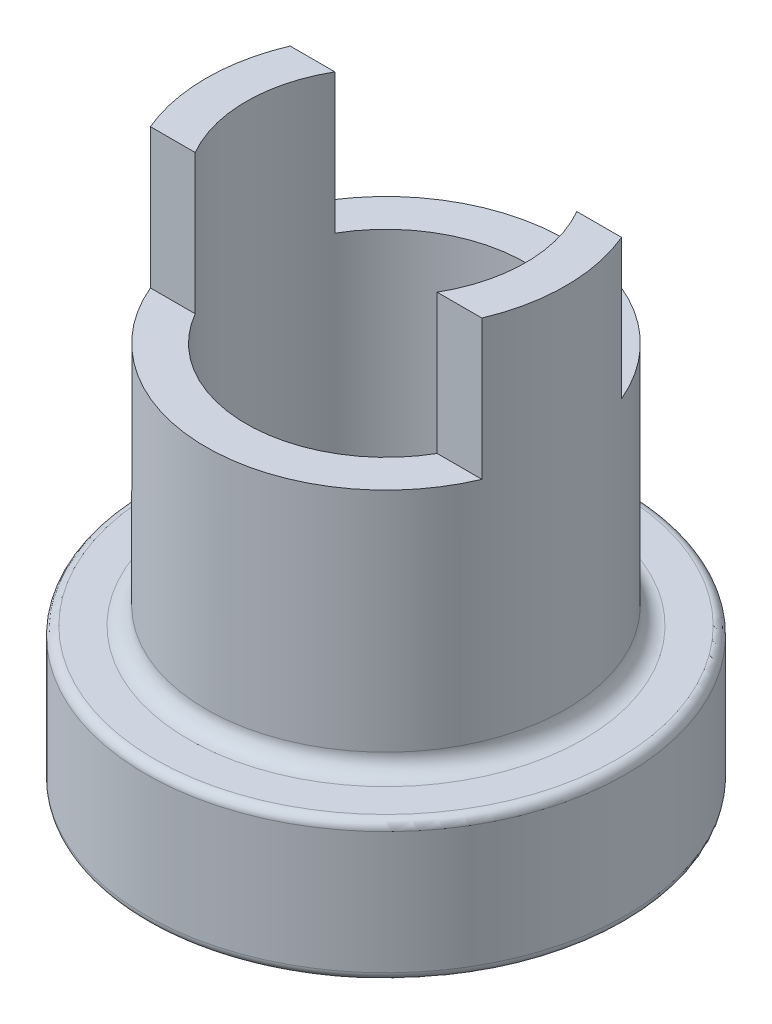
ISO-10303-21;
HEADER;
FILE_DESCRIPTION(('STEP AP214'),'2;1');
FILE_NAME('part.step','',(''),(''),'','','');
FILE_SCHEMA(('AUTOMOTIVE_DESIGN { 1 0 10303 214 1 1 1 1 }'));
ENDSEC;
DATA;
#1=APPLICATION_CONTEXT('core data for automotive mechanical design processes');
#2=APPLICATION_PROTOCOL_DEFINITION('international standard','automotive_design',2000,#1);
#3=PRODUCT_CONTEXT('',#1,'mechanical');
#4=PRODUCT('Part','Part','',(#3));
#5=PRODUCT_RELATED_PRODUCT_CATEGORY('part','',(#4));
#6=PRODUCT_DEFINITION_FORMATION('','',#4);
#7=PRODUCT_DEFINITION_CONTEXT('part definition',#1,'design');
#8=PRODUCT_DEFINITION('design','',#6,#7);
#9=PRODUCT_DEFINITION_SHAPE('','',#8);
#10=(LENGTH_UNIT() NAMED_UNIT(*) SI_UNIT(.MILLI.,.METRE.));
#11=(NAMED_UNIT(*) PLANE_ANGLE_UNIT() SI_UNIT($,.RADIAN.));
#12=(NAMED_UNIT(*) SI_UNIT($,.STERADIAN.) SOLID_ANGLE_UNIT());
#13=UNCERTAINTY_MEASURE_WITH_UNIT(LENGTH_MEASURE(1.E-05),#10,'distance_accuracy_value','');
#14=(GEOMETRIC_REPRESENTATION_CONTEXT(3) GLOBAL_UNCERTAINTY_ASSIGNED_CONTEXT((#13)) GLOBAL_UNIT_ASSIGNED_CONTEXT((#10,
#11,#12)) REPRESENTATION_CONTEXT('',''));
#15=CARTESIAN_POINT('',(0.,0.,0.));
#16=DIRECTION('',(0.,0.,1.));
#17=DIRECTION('',(1.,0.,0.));
#18=AXIS2_PLACEMENT_3D('',#15,#16,#17);
#19=CARTESIAN_POINT('',(-5.15,15.,0.));
#20=DIRECTION('',(0.,1.,0.));
#21=DIRECTION('',(-1.,0.,0.));
#22=AXIS2_PLACEMENT_3D('',#19,#20,#21);
#23=PLANE('',#22);
#24=DIRECTION('',(1.,0.,0.));
#25=VECTOR('',#24,1.);
#26=CARTESIAN_POINT('',(-6.875,15.,2.));
#27=LINE('',#26,#25);
#28=CARTESIAN_POINT('',(3.46410161513775,15.,2.));
#29=VERTEX_POINT('',#28);
#30=CARTESIAN_POINT('',(4.74578760586691,15.,2.));
#31=VERTEX_POINT('',#30);
#32=EDGE_CURVE('E210',#29,#31,#27,.T.);
#33=ORIENTED_EDGE('',*,*,#32,.T.);
#34=CARTESIAN_POINT('',(0.,15.,0.));
#35=DIRECTION('',(0.,1.,0.));
#36=DIRECTION('',(-1.,0.,0.));
#37=AXIS2_PLACEMENT_3D('',#34,#35,#36);
#38=CIRCLE('',#37,5.15);
#39=CARTESIAN_POINT('',(4.74578760586691,15.,-2.));
#40=VERTEX_POINT('',#39);
#41=EDGE_CURVE('E135',#31,#40,#38,.T.);
#42=ORIENTED_EDGE('',*,*,#41,.T.);
#43=DIRECTION('',(1.,0.,0.));
#44=VECTOR('',#43,1.);
#45=CARTESIAN_POINT('',(-6.875,15.,-2.));
#46=LINE('',#45,#44);
#47=CARTESIAN_POINT('',(3.46410161513775,15.,-2.));
#48=VERTEX_POINT('',#47);
#49=EDGE_CURVE('E113',#48,#40,#46,.T.);
#50=ORIENTED_EDGE('',*,*,#49,.F.);
#51=CARTESIAN_POINT('',(0.,15.,0.));
#52=DIRECTION('',(0.,1.,0.));
#53=DIRECTION('',(-1.,0.,0.));
#54=AXIS2_PLACEMENT_3D('',#51,#52,#53);
#55=CIRCLE('',#54,4.);
#56=EDGE_CURVE('E133',#29,#48,#55,.T.);
#57=ORIENTED_EDGE('',*,*,#56,.F.);
#58=EDGE_LOOP('',(#33,#42,#50,#57));
#59=FACE_BOUND('',#58,.T.);
#60=ADVANCED_FACE('F33',(#59),#23,.T.);
#61=CARTESIAN_POINT('',(0.,0.,0.));
#62=DIRECTION('',(0.,-1.,0.));
#63=DIRECTION('',(1.,0.,0.));
#64=AXIS2_PLACEMENT_3D('',#61,#62,#63);
#65=PLANE('',#64);
#66=CARTESIAN_POINT('',(0.,0.,0.));
#67=DIRECTION('',(0.,-1.,0.));
#68=DIRECTION('',(1.,0.,0.));
#69=AXIS2_PLACEMENT_3D('',#66,#67,#68);
#70=CIRCLE('',#69,4.75000000000001);
#71=CARTESIAN_POINT('',(4.75000000000001,0.,0.));
#72=VERTEX_POINT('',#71);
#73=EDGE_CURVE('E41',#72,#72,#70,.F.);
#74=ORIENTED_EDGE('',*,*,#73,.T.);
#75=EDGE_LOOP('',(#74));
#76=FACE_BOUND('',#75,.T.);
#77=CARTESIAN_POINT('',(0.,0.,0.));
#78=DIRECTION('',(0.,-1.,0.));
#79=DIRECTION('',(1.,0.,0.));
#80=AXIS2_PLACEMENT_3D('',#77,#78,#79);
#81=CIRCLE('',#80,6.625);
#82=CARTESIAN_POINT('',(6.625,0.,0.));
#83=VERTEX_POINT('',#82);
#84=EDGE_CURVE('E163',#83,#83,#81,.T.);
#85=ORIENTED_EDGE('',*,*,#84,.T.);
#86=EDGE_LOOP('',(#85));
#87=FACE_BOUND('',#86,.T.);
#88=ADVANCED_FACE('F171',(#76,#87),#65,.T.);
#89=CARTESIAN_POINT('',(0.,15.,0.));
#90=DIRECTION('',(0.,1.,0.));
#91=DIRECTION('',(-1.,0.,0.));
#92=AXIS2_PLACEMENT_3D('',#89,#90,#91);
#93=CYLINDRICAL_SURFACE('',#92,6.875);
#94=CARTESIAN_POINT('',(0.,0.25,0.));
#95=DIRECTION('',(0.,-1.,0.));
#96=DIRECTION('',(1.,0.,0.));
#97=AXIS2_PLACEMENT_3D('',#94,#95,#96);
#98=CIRCLE('',#97,6.875);
#99=CARTESIAN_POINT('',(6.875,0.25,0.));
#100=VERTEX_POINT('',#99);
#101=EDGE_CURVE('E160',#100,#100,#98,.F.);
#102=ORIENTED_EDGE('',*,*,#101,.T.);
#103=EDGE_LOOP('',(#102));
#104=FACE_BOUND('',#103,.T.);
#105=CARTESIAN_POINT('',(0.,3.75,0.));
#106=DIRECTION('',(0.,1.,0.));
#107=DIRECTION('',(-1.,0.,0.));
#108=AXIS2_PLACEMENT_3D('',#105,#106,#107);
#109=CIRCLE('',#108,6.875);
#110=CARTESIAN_POINT('',(-6.875,3.75,0.));
#111=VERTEX_POINT('',#110);
#112=EDGE_CURVE('E157',#111,#111,#109,.F.);
#113=ORIENTED_EDGE('',*,*,#112,.T.);
#114=EDGE_LOOP('',(#113));
#115=FACE_BOUND('',#114,.T.);
#116=ADVANCED_FACE('F190',(#104,#115),#93,.T.);
#117=CARTESIAN_POINT('',(-6.875,4.,0.));
#118=DIRECTION('',(0.,1.,0.));
#119=DIRECTION('',(-1.,0.,0.));
#120=AXIS2_PLACEMENT_3D('',#117,#118,#119);
#121=PLANE('',#120);
#122=CARTESIAN_POINT('',(0.,4.,0.));
#123=DIRECTION('',(0.,1.,0.));
#124=DIRECTION('',(-1.,0.,0.));
#125=AXIS2_PLACEMENT_3D('',#122,#123,#124);
#126=CIRCLE('',#125,6.625);
#127=CARTESIAN_POINT('',(-6.625,4.,0.));
#128=VERTEX_POINT('',#127);
#129=EDGE_CURVE('E166',#128,#128,#126,.T.);
#130=ORIENTED_EDGE('',*,*,#129,.T.);
#131=EDGE_LOOP('',(#130));
#132=FACE_BOUND('',#131,.T.);
#133=CARTESIAN_POINT('',(0.,4.,0.));
#134=DIRECTION('',(0.,1.,0.));
#135=DIRECTION('',(-1.,0.,0.));
#136=AXIS2_PLACEMENT_3D('',#133,#134,#135);
#137=CIRCLE('',#136,5.65);
#138=CARTESIAN_POINT('',(-5.65,4.,0.));
#139=VERTEX_POINT('',#138);
#140=EDGE_CURVE('E154',#139,#139,#137,.F.);
#141=ORIENTED_EDGE('',*,*,#140,.T.);
#142=EDGE_LOOP('',(#141));
#143=FACE_BOUND('',#142,.T.);
#144=ADVANCED_FACE('F204',(#132,#143),#121,.T.);
#145=CARTESIAN_POINT('',(0.,15.,0.));
#146=DIRECTION('',(0.,1.,0.));
#147=DIRECTION('',(-1.,0.,0.));
#148=AXIS2_PLACEMENT_3D('',#145,#146,#147);
#149=CYLINDRICAL_SURFACE('',#148,5.15);
#150=CARTESIAN_POINT('',(0.,4.5,0.));
#151=DIRECTION('',(0.,1.,0.));
#152=DIRECTION('',(-1.,0.,0.));
#153=AXIS2_PLACEMENT_3D('',#150,#151,#152);
#154=CIRCLE('',#153,5.15);
#155=CARTESIAN_POINT('',(-5.15,4.5,0.));
#156=VERTEX_POINT('',#155);
#157=EDGE_CURVE('E151',#156,#156,#154,.T.);
#158=ORIENTED_EDGE('',*,*,#157,.T.);
#159=EDGE_LOOP('',(#158));
#160=FACE_BOUND('',#159,.T.);
#161=DIRECTION('',(0.,1.,0.));
#162=VECTOR('',#161,1.);
#163=CARTESIAN_POINT('',(-4.74578760586691,15.,2.));
#164=LINE('',#163,#162);
#165=CARTESIAN_POINT('',(-4.74578760586691,15.,2.));
#166=VERTEX_POINT('',#165);
#167=CARTESIAN_POINT('',(-4.74578760586691,11.,2.));
#168=VERTEX_POINT('',#167);
#169=EDGE_CURVE('E128',#166,#168,#164,.F.);
#170=ORIENTED_EDGE('',*,*,#169,.F.);
#171=CARTESIAN_POINT('',(-4.74578760586691,15.,-2.));
#172=VERTEX_POINT('',#171);
#173=EDGE_CURVE('E119',#172,#166,#38,.T.);
#174=ORIENTED_EDGE('',*,*,#173,.F.);
#175=DIRECTION('',(0.,1.,0.));
#176=VECTOR('',#175,1.);
#177=CARTESIAN_POINT('',(-4.74578760586691,15.,-2.));
#178=LINE('',#177,#176);
#179=CARTESIAN_POINT('',(-4.74578760586691,11.,-2.));
#180=VERTEX_POINT('',#179);
#181=EDGE_CURVE('E104',#180,#172,#178,.T.);
#182=ORIENTED_EDGE('',*,*,#181,.F.);
#183=CARTESIAN_POINT('',(0.,11.,0.));
#184=DIRECTION('',(0.,-1.,0.));
#185=DIRECTION('',(1.,0.,0.));
#186=AXIS2_PLACEMENT_3D('',#183,#184,#185);
#187=CIRCLE('',#186,5.15);
#188=CARTESIAN_POINT('',(4.74578760586691,11.,-2.));
#189=VERTEX_POINT('',#188);
#190=EDGE_CURVE('E97',#189,#180,#187,.F.);
#191=ORIENTED_EDGE('',*,*,#190,.F.);
#192=DIRECTION('',(0.,1.,0.));
#193=VECTOR('',#192,1.);
#194=CARTESIAN_POINT('',(4.74578760586691,15.,-2.));
#195=LINE('',#194,#193);
#196=EDGE_CURVE('E120',#40,#189,#195,.F.);
#197=ORIENTED_EDGE('',*,*,#196,.F.);
#198=ORIENTED_EDGE('',*,*,#41,.F.);
#199=DIRECTION('',(0.,1.,0.));
#200=VECTOR('',#199,1.);
#201=CARTESIAN_POINT('',(4.74578760586691,15.,2.));
#202=LINE('',#201,#200);
#203=CARTESIAN_POINT('',(4.74578760586691,11.,2.));
#204=VERTEX_POINT('',#203);
#205=EDGE_CURVE('E126',#204,#31,#202,.T.);
#206=ORIENTED_EDGE('',*,*,#205,.F.);
#207=CARTESIAN_POINT('',(0.,11.,0.));
#208=DIRECTION('',(0.,-1.,0.));
#209=DIRECTION('',(1.,0.,0.));
#210=AXIS2_PLACEMENT_3D('',#207,#208,#209);
#211=CIRCLE('',#210,5.15);
#212=EDGE_CURVE('E122',#168,#204,#211,.F.);
#213=ORIENTED_EDGE('',*,*,#212,.F.);
#214=EDGE_LOOP('',(#170,#174,#182,#191,#197,#198,#206,#213));
#215=FACE_BOUND('',#214,.T.);
#216=ADVANCED_FACE('F117',(#160,#215),#149,.T.);
#217=CARTESIAN_POINT('',(-3.46410161513775,15.,2.));
#218=VERTEX_POINT('',#217);
#219=EDGE_CURVE('E208',#166,#218,#27,.T.);
#220=ORIENTED_EDGE('',*,*,#219,.T.);
#221=CARTESIAN_POINT('',(-3.46410161513775,15.,-2.));
#222=VERTEX_POINT('',#221);
#223=EDGE_CURVE('E130',#222,#218,#55,.T.);
#224=ORIENTED_EDGE('',*,*,#223,.F.);
#225=EDGE_CURVE('E217',#172,#222,#46,.T.);
#226=ORIENTED_EDGE('',*,*,#225,.F.);
#227=ORIENTED_EDGE('',*,*,#173,.T.);
#228=EDGE_LOOP('',(#220,#224,#226,#227));
#229=FACE_BOUND('',#228,.T.);
#230=ADVANCED_FACE('F186',(#229),#23,.T.);
#231=CARTESIAN_POINT('',(0.,0.,0.));
#232=DIRECTION('',(0.,1.,0.));
#233=DIRECTION('',(-1.,0.,0.));
#234=AXIS2_PLACEMENT_3D('',#231,#232,#233);
#235=CYLINDRICAL_SURFACE('',#234,4.);
#236=CARTESIAN_POINT('',(0.,0.750000000000009,0.));
#237=DIRECTION('',(0.,-1.,0.));
#238=DIRECTION('',(1.,0.,0.));
#239=AXIS2_PLACEMENT_3D('',#236,#237,#238);
#240=CIRCLE('',#239,4.);
#241=CARTESIAN_POINT('',(4.,0.750000000000009,0.));
#242=VERTEX_POINT('',#241);
#243=EDGE_CURVE('E11',#242,#242,#240,.T.);
#244=ORIENTED_EDGE('',*,*,#243,.T.);
#245=EDGE_LOOP('',(#244));
#246=FACE_BOUND('',#245,.T.);
#247=ORIENTED_EDGE('',*,*,#223,.T.);
#248=DIRECTION('',(0.,1.,0.));
#249=VECTOR('',#248,1.);
#250=CARTESIAN_POINT('',(-3.46410161513775,0.,2.));
#251=LINE('',#250,#249);
#252=CARTESIAN_POINT('',(-3.46410161513775,11.,2.));
#253=VERTEX_POINT('',#252);
#254=EDGE_CURVE('E148',#218,#253,#251,.F.);
#255=ORIENTED_EDGE('',*,*,#254,.T.);
#256=CARTESIAN_POINT('',(0.,11.,0.));
#257=DIRECTION('',(0.,-1.,0.));
#258=DIRECTION('',(1.,0.,0.));
#259=AXIS2_PLACEMENT_3D('',#256,#257,#258);
#260=CIRCLE('',#259,4.);
#261=CARTESIAN_POINT('',(3.46410161513775,11.,2.));
#262=VERTEX_POINT('',#261);
#263=EDGE_CURVE('E142',#253,#262,#260,.F.);
#264=ORIENTED_EDGE('',*,*,#263,.T.);
#265=DIRECTION('',(0.,1.,0.));
#266=VECTOR('',#265,1.);
#267=CARTESIAN_POINT('',(3.46410161513775,0.,2.));
#268=LINE('',#267,#266);
#269=EDGE_CURVE('E145',#262,#29,#268,.T.);
#270=ORIENTED_EDGE('',*,*,#269,.T.);
#271=ORIENTED_EDGE('',*,*,#56,.T.);
#272=DIRECTION('',(0.,1.,0.));
#273=VECTOR('',#272,1.);
#274=CARTESIAN_POINT('',(3.46410161513775,0.,-2.));
#275=LINE('',#274,#273);
#276=CARTESIAN_POINT('',(3.46410161513775,11.,-2.));
#277=VERTEX_POINT('',#276);
#278=EDGE_CURVE('E139',#48,#277,#275,.F.);
#279=ORIENTED_EDGE('',*,*,#278,.T.);
#280=CARTESIAN_POINT('',(0.,11.,0.));
#281=DIRECTION('',(0.,-1.,0.));
#282=DIRECTION('',(1.,0.,0.));
#283=AXIS2_PLACEMENT_3D('',#280,#281,#282);
#284=CIRCLE('',#283,4.);
#285=CARTESIAN_POINT('',(-3.46410161513775,11.,-2.));
#286=VERTEX_POINT('',#285);
#287=EDGE_CURVE('E136',#277,#286,#284,.F.);
#288=ORIENTED_EDGE('',*,*,#287,.T.);
#289=DIRECTION('',(0.,1.,0.));
#290=VECTOR('',#289,1.);
#291=CARTESIAN_POINT('',(-3.46410161513775,0.,-2.));
#292=LINE('',#291,#290);
#293=EDGE_CURVE('E111',#286,#222,#292,.T.);
#294=ORIENTED_EDGE('',*,*,#293,.T.);
#295=EDGE_LOOP('',(#247,#255,#264,#270,#271,#279,#288,#294));
#296=FACE_BOUND('',#295,.T.);
#297=ADVANCED_FACE('F196',(#246,#296),#235,.F.);
#298=CARTESIAN_POINT('',(-6.875,15.,-2.));
#299=DIRECTION('',(0.,0.,1.));
#300=DIRECTION('',(1.,0.,0.));
#301=AXIS2_PLACEMENT_3D('',#298,#299,#300);
#302=PLANE('',#301);
#303=ORIENTED_EDGE('',*,*,#196,.T.);
#304=DIRECTION('',(1.,0.,0.));
#305=VECTOR('',#304,1.);
#306=CARTESIAN_POINT('',(-6.875,11.,-2.));
#307=LINE('',#306,#305);
#308=EDGE_CURVE('E100',#277,#189,#307,.T.);
#309=ORIENTED_EDGE('',*,*,#308,.F.);
#310=ORIENTED_EDGE('',*,*,#278,.F.);
#311=ORIENTED_EDGE('',*,*,#49,.T.);
#312=EDGE_LOOP('',(#303,#309,#310,#311));
#313=FACE_BOUND('',#312,.T.);
#314=ADVANCED_FACE('F202',(#313),#302,.F.);
#315=ORIENTED_EDGE('',*,*,#181,.T.);
#316=ORIENTED_EDGE('',*,*,#225,.T.);
#317=ORIENTED_EDGE('',*,*,#293,.F.);
#318=EDGE_CURVE('E56',#180,#286,#307,.T.);
#319=ORIENTED_EDGE('',*,*,#318,.F.);
#320=EDGE_LOOP('',(#315,#316,#317,#319));
#321=FACE_BOUND('',#320,.T.);
#322=ADVANCED_FACE('F108',(#321),#302,.F.);
#323=CARTESIAN_POINT('',(-6.875,11.,-2.));
#324=DIRECTION('',(0.,-1.,0.));
#325=DIRECTION('',(1.,0.,0.));
#326=AXIS2_PLACEMENT_3D('',#323,#324,#325);
#327=PLANE('',#326);
#328=ORIENTED_EDGE('',*,*,#190,.T.);
#329=ORIENTED_EDGE('',*,*,#318,.T.);
#330=ORIENTED_EDGE('',*,*,#287,.F.);
#331=ORIENTED_EDGE('',*,*,#308,.T.);
#332=EDGE_LOOP('',(#328,#329,#330,#331));
#333=FACE_BOUND('',#332,.T.);
#334=ADVANCED_FACE('F98',(#333),#327,.F.);
#335=CARTESIAN_POINT('',(-6.875,15.,2.));
#336=DIRECTION('',(0.,0.,-1.));
#337=DIRECTION('',(-1.,0.,0.));
#338=AXIS2_PLACEMENT_3D('',#335,#336,#337);
#339=PLANE('',#338);
#340=ORIENTED_EDGE('',*,*,#169,.T.);
#341=DIRECTION('',(1.,0.,0.));
#342=VECTOR('',#341,1.);
#343=CARTESIAN_POINT('',(-6.875,11.,2.));
#344=LINE('',#343,#342);
#345=EDGE_CURVE('E105',#168,#253,#344,.T.);
#346=ORIENTED_EDGE('',*,*,#345,.T.);
#347=ORIENTED_EDGE('',*,*,#254,.F.);
#348=ORIENTED_EDGE('',*,*,#219,.F.);
#349=EDGE_LOOP('',(#340,#346,#347,#348));
#350=FACE_BOUND('',#349,.T.);
#351=ADVANCED_FACE('F223',(#350),#339,.F.);
#352=ORIENTED_EDGE('',*,*,#205,.T.);
#353=ORIENTED_EDGE('',*,*,#32,.F.);
#354=ORIENTED_EDGE('',*,*,#269,.F.);
#355=EDGE_CURVE('E48',#262,#204,#344,.T.);
#356=ORIENTED_EDGE('',*,*,#355,.T.);
#357=EDGE_LOOP('',(#352,#353,#354,#356));
#358=FACE_BOUND('',#357,.T.);
#359=ADVANCED_FACE('F228',(#358),#339,.F.);
#360=CARTESIAN_POINT('',(-6.875,11.,2.));
#361=DIRECTION('',(0.,-1.,0.));
#362=DIRECTION('',(1.,0.,0.));
#363=AXIS2_PLACEMENT_3D('',#360,#361,#362);
#364=PLANE('',#363);
#365=ORIENTED_EDGE('',*,*,#212,.T.);
#366=ORIENTED_EDGE('',*,*,#355,.F.);
#367=ORIENTED_EDGE('',*,*,#263,.F.);
#368=ORIENTED_EDGE('',*,*,#345,.F.);
#369=EDGE_LOOP('',(#365,#366,#367,#368));
#370=FACE_BOUND('',#369,.T.);
#371=ADVANCED_FACE('F225',(#370),#364,.F.);
#372=CARTESIAN_POINT('',(0.,4.5,0.));
#373=DIRECTION('',(0.,1.,0.));
#374=DIRECTION('',(-1.,0.,0.));
#375=AXIS2_PLACEMENT_3D('',#372,#373,#374);
#376=TOROIDAL_SURFACE('',#375,5.65,0.5);
#377=ORIENTED_EDGE('',*,*,#140,.F.);
#378=EDGE_LOOP('',(#377));
#379=FACE_BOUND('',#378,.T.);
#380=ORIENTED_EDGE('',*,*,#157,.F.);
#381=EDGE_LOOP('',(#380));
#382=FACE_BOUND('',#381,.T.);
#383=ADVANCED_FACE('F236',(#379,#382),#376,.F.);
#384=CARTESIAN_POINT('',(0.,0.25,0.));
#385=DIRECTION('',(0.,-1.,0.));
#386=DIRECTION('',(1.,0.,0.));
#387=AXIS2_PLACEMENT_3D('',#384,#385,#386);
#388=TOROIDAL_SURFACE('',#387,6.625,0.25);
#389=ORIENTED_EDGE('',*,*,#84,.F.);
#390=EDGE_LOOP('',(#389));
#391=FACE_BOUND('',#390,.T.);
#392=ORIENTED_EDGE('',*,*,#101,.F.);
#393=EDGE_LOOP('',(#392));
#394=FACE_BOUND('',#393,.T.);
#395=ADVANCED_FACE('F180',(#391,#394),#388,.T.);
#396=CARTESIAN_POINT('',(0.,3.75,0.));
#397=DIRECTION('',(0.,1.,0.));
#398=DIRECTION('',(-1.,0.,0.));
#399=AXIS2_PLACEMENT_3D('',#396,#397,#398);
#400=TOROIDAL_SURFACE('',#399,6.625,0.25);
#401=ORIENTED_EDGE('',*,*,#112,.F.);
#402=EDGE_LOOP('',(#401));
#403=FACE_BOUND('',#402,.T.);
#404=ORIENTED_EDGE('',*,*,#129,.F.);
#405=EDGE_LOOP('',(#404));
#406=FACE_BOUND('',#405,.T.);
#407=ADVANCED_FACE('F175',(#403,#406),#400,.T.);
#408=CARTESIAN_POINT('',(0.,0.,0.));
#409=DIRECTION('',(0.,-1.,0.));
#410=DIRECTION('',(1.,0.,0.));
#411=AXIS2_PLACEMENT_3D('',#408,#409,#410);
#412=CONICAL_SURFACE('',#411,4.75000000000001,0.785398163397447);
#413=ORIENTED_EDGE('',*,*,#243,.F.);
#414=EDGE_LOOP('',(#413));
#415=FACE_BOUND('',#414,.T.);
#416=ORIENTED_EDGE('',*,*,#73,.F.);
#417=EDGE_LOOP('',(#416));
#418=FACE_BOUND('',#417,.T.);
#419=ADVANCED_FACE('F35',(#415,#418),#412,.F.);
#420=CLOSED_SHELL('',(#60,#88,#116,#144,#216,#230,#297,#314,#322,#334,#351,#359,#371,#383,#395,
#407,#419));
#421=MANIFOLD_SOLID_BREP('B2',#420);
#422=ADVANCED_BREP_SHAPE_REPRESENTATION('',(#18,#421),#14);
#423=SHAPE_DEFINITION_REPRESENTATION(#9,#422);
ENDSEC;
END-ISO-10303-21;
